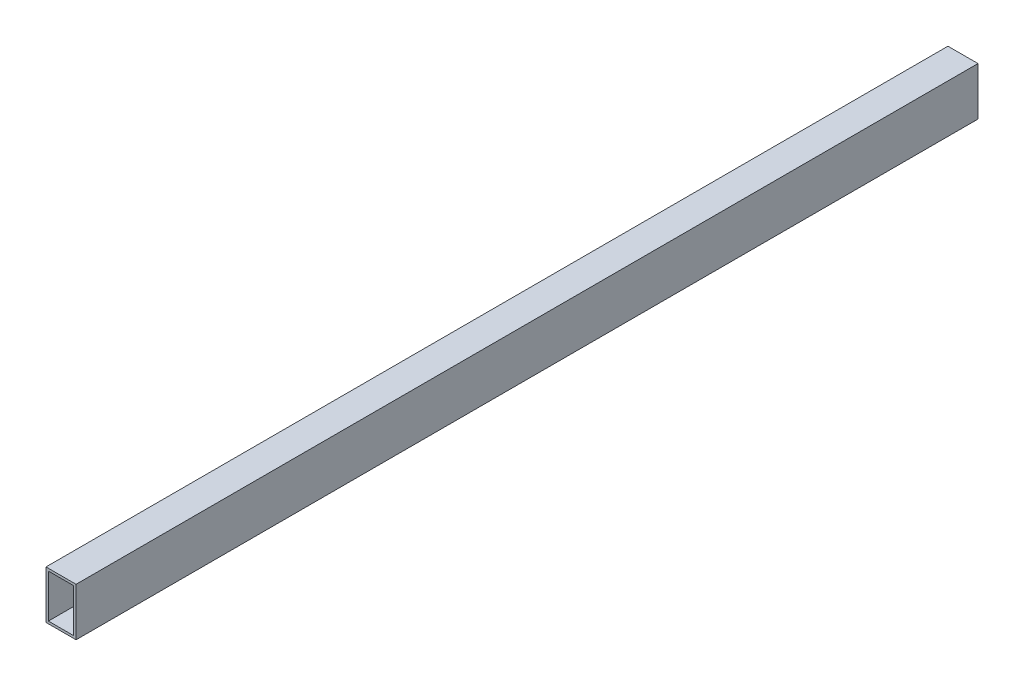
ISO-10303-21;
HEADER;
FILE_DESCRIPTION(('STEP AP214'),'2;1');
FILE_NAME('part.step','',(''),(''),'','','');
FILE_SCHEMA(('AUTOMOTIVE_DESIGN { 1 0 10303 214 1 1 1 1 }'));
ENDSEC;
DATA;
#1=APPLICATION_CONTEXT('core data for automotive mechanical design processes');
#2=APPLICATION_PROTOCOL_DEFINITION('international standard','automotive_design',2000,#1);
#3=PRODUCT_CONTEXT('',#1,'mechanical');
#4=PRODUCT('Part','Part','',(#3));
#5=PRODUCT_RELATED_PRODUCT_CATEGORY('part','',(#4));
#6=PRODUCT_DEFINITION_FORMATION('','',#4);
#7=PRODUCT_DEFINITION_CONTEXT('part definition',#1,'design');
#8=PRODUCT_DEFINITION('design','',#6,#7);
#9=PRODUCT_DEFINITION_SHAPE('','',#8);
#10=(LENGTH_UNIT() NAMED_UNIT(*) SI_UNIT(.MILLI.,.METRE.));
#11=(NAMED_UNIT(*) PLANE_ANGLE_UNIT() SI_UNIT($,.RADIAN.));
#12=(NAMED_UNIT(*) SI_UNIT($,.STERADIAN.) SOLID_ANGLE_UNIT());
#13=UNCERTAINTY_MEASURE_WITH_UNIT(LENGTH_MEASURE(1.E-05),#10,'distance_accuracy_value','');
#14=(GEOMETRIC_REPRESENTATION_CONTEXT(3) GLOBAL_UNCERTAINTY_ASSIGNED_CONTEXT((#13)) GLOBAL_UNIT_ASSIGNED_CONTEXT((#10,
#11,#12)) REPRESENTATION_CONTEXT('',''));
#15=CARTESIAN_POINT('',(0.,0.,0.));
#16=DIRECTION('',(0.,0.,1.));
#17=DIRECTION('',(1.,0.,0.));
#18=AXIS2_PLACEMENT_3D('',#15,#16,#17);
#19=CARTESIAN_POINT('',(-25.,40.,1500.));
#20=DIRECTION('',(1.,0.,0.));
#21=DIRECTION('',(0.,1.,0.));
#22=AXIS2_PLACEMENT_3D('',#19,#20,#21);
#23=PLANE('',#22);
#24=DIRECTION('',(0.,-1.,0.));
#25=VECTOR('',#24,1.);
#26=CARTESIAN_POINT('',(-25.,40.,0.));
#27=LINE('',#26,#25);
#28=CARTESIAN_POINT('',(-25.,40.,0.));
#29=VERTEX_POINT('',#28);
#30=CARTESIAN_POINT('',(-25.,-40.,0.));
#31=VERTEX_POINT('',#30);
#32=EDGE_CURVE('E131',#29,#31,#27,.T.);
#33=ORIENTED_EDGE('',*,*,#32,.T.);
#34=DIRECTION('',(0.,0.,-1.));
#35=VECTOR('',#34,1.);
#36=CARTESIAN_POINT('',(-25.,-40.,1500.));
#37=LINE('',#36,#35);
#38=CARTESIAN_POINT('',(-25.,-40.,1500.));
#39=VERTEX_POINT('',#38);
#40=EDGE_CURVE('E11',#39,#31,#37,.T.);
#41=ORIENTED_EDGE('',*,*,#40,.F.);
#42=DIRECTION('',(0.,-1.,0.));
#43=VECTOR('',#42,1.);
#44=CARTESIAN_POINT('',(-25.,40.,1500.));
#45=LINE('',#44,#43);
#46=CARTESIAN_POINT('',(-25.,40.,1500.));
#47=VERTEX_POINT('',#46);
#48=EDGE_CURVE('E135',#47,#39,#45,.T.);
#49=ORIENTED_EDGE('',*,*,#48,.F.);
#50=DIRECTION('',(0.,0.,-1.));
#51=VECTOR('',#50,1.);
#52=CARTESIAN_POINT('',(-25.,40.,1500.));
#53=LINE('',#52,#51);
#54=EDGE_CURVE('E147',#47,#29,#53,.T.);
#55=ORIENTED_EDGE('',*,*,#54,.T.);
#56=EDGE_LOOP('',(#33,#41,#49,#55));
#57=FACE_BOUND('',#56,.T.);
#58=ADVANCED_FACE('F34',(#57),#23,.F.);
#59=CARTESIAN_POINT('',(-25.,-40.,1500.));
#60=DIRECTION('',(0.,1.,0.));
#61=DIRECTION('',(0.,0.,1.));
#62=AXIS2_PLACEMENT_3D('',#59,#60,#61);
#63=PLANE('',#62);
#64=DIRECTION('',(1.,0.,0.));
#65=VECTOR('',#64,1.);
#66=CARTESIAN_POINT('',(-25.,-40.,0.));
#67=LINE('',#66,#65);
#68=CARTESIAN_POINT('',(25.,-40.,0.));
#69=VERTEX_POINT('',#68);
#70=EDGE_CURVE('E150',#31,#69,#67,.T.);
#71=ORIENTED_EDGE('',*,*,#70,.T.);
#72=DIRECTION('',(0.,0.,-1.));
#73=VECTOR('',#72,1.);
#74=CARTESIAN_POINT('',(25.,-40.,1500.));
#75=LINE('',#74,#73);
#76=CARTESIAN_POINT('',(25.,-40.,1500.));
#77=VERTEX_POINT('',#76);
#78=EDGE_CURVE('E41',#77,#69,#75,.T.);
#79=ORIENTED_EDGE('',*,*,#78,.F.);
#80=DIRECTION('',(1.,0.,0.));
#81=VECTOR('',#80,1.);
#82=CARTESIAN_POINT('',(-25.,-40.,1500.));
#83=LINE('',#82,#81);
#84=EDGE_CURVE('E138',#39,#77,#83,.T.);
#85=ORIENTED_EDGE('',*,*,#84,.F.);
#86=ORIENTED_EDGE('',*,*,#40,.T.);
#87=EDGE_LOOP('',(#71,#79,#85,#86));
#88=FACE_BOUND('',#87,.T.);
#89=ADVANCED_FACE('F166',(#88),#63,.F.);
#90=CARTESIAN_POINT('',(25.,40.,1500.));
#91=DIRECTION('',(1.,0.,0.));
#92=DIRECTION('',(0.,0.,-1.));
#93=AXIS2_PLACEMENT_3D('',#90,#91,#92);
#94=PLANE('',#93);
#95=DIRECTION('',(0.,-1.,0.));
#96=VECTOR('',#95,1.);
#97=CARTESIAN_POINT('',(25.,40.,0.));
#98=LINE('',#97,#96);
#99=CARTESIAN_POINT('',(25.,40.,0.));
#100=VERTEX_POINT('',#99);
#101=EDGE_CURVE('E153',#100,#69,#98,.T.);
#102=ORIENTED_EDGE('',*,*,#101,.F.);
#103=DIRECTION('',(0.,0.,-1.));
#104=VECTOR('',#103,1.);
#105=CARTESIAN_POINT('',(25.,40.,1500.));
#106=LINE('',#105,#104);
#107=CARTESIAN_POINT('',(25.,40.,1500.));
#108=VERTEX_POINT('',#107);
#109=EDGE_CURVE('E159',#108,#100,#106,.T.);
#110=ORIENTED_EDGE('',*,*,#109,.F.);
#111=DIRECTION('',(0.,-1.,0.));
#112=VECTOR('',#111,1.);
#113=CARTESIAN_POINT('',(25.,40.,1500.));
#114=LINE('',#113,#112);
#115=EDGE_CURVE('E141',#108,#77,#114,.T.);
#116=ORIENTED_EDGE('',*,*,#115,.T.);
#117=ORIENTED_EDGE('',*,*,#78,.T.);
#118=EDGE_LOOP('',(#102,#110,#116,#117));
#119=FACE_BOUND('',#118,.T.);
#120=ADVANCED_FACE('F163',(#119),#94,.T.);
#121=CARTESIAN_POINT('',(-25.,40.,1500.));
#122=DIRECTION('',(0.,1.,0.));
#123=DIRECTION('',(0.,0.,1.));
#124=AXIS2_PLACEMENT_3D('',#121,#122,#123);
#125=PLANE('',#124);
#126=DIRECTION('',(1.,0.,0.));
#127=VECTOR('',#126,1.);
#128=CARTESIAN_POINT('',(-25.,40.,0.));
#129=LINE('',#128,#127);
#130=EDGE_CURVE('E139',#29,#100,#129,.T.);
#131=ORIENTED_EDGE('',*,*,#130,.F.);
#132=ORIENTED_EDGE('',*,*,#54,.F.);
#133=DIRECTION('',(1.,0.,0.));
#134=VECTOR('',#133,1.);
#135=CARTESIAN_POINT('',(-25.,40.,1500.));
#136=LINE('',#135,#134);
#137=EDGE_CURVE('E144',#47,#108,#136,.T.);
#138=ORIENTED_EDGE('',*,*,#137,.T.);
#139=ORIENTED_EDGE('',*,*,#109,.T.);
#140=EDGE_LOOP('',(#131,#132,#138,#139));
#141=FACE_BOUND('',#140,.T.);
#142=ADVANCED_FACE('F173',(#141),#125,.T.);
#143=CARTESIAN_POINT('',(0.,0.,1500.));
#144=DIRECTION('',(0.,0.,1.));
#145=DIRECTION('',(1.,0.,0.));
#146=AXIS2_PLACEMENT_3D('',#143,#144,#145);
#147=PLANE('',#146);
#148=DIRECTION('',(0.,1.,0.));
#149=VECTOR('',#148,1.);
#150=CARTESIAN_POINT('',(-21.,36.,1500.));
#151=LINE('',#150,#149);
#152=CARTESIAN_POINT('',(-21.,-36.,1500.));
#153=VERTEX_POINT('',#152);
#154=CARTESIAN_POINT('',(-21.,36.,1500.));
#155=VERTEX_POINT('',#154);
#156=EDGE_CURVE('E100',#153,#155,#151,.T.);
#157=ORIENTED_EDGE('',*,*,#156,.T.);
#158=DIRECTION('',(1.,0.,0.));
#159=VECTOR('',#158,1.);
#160=CARTESIAN_POINT('',(21.,36.,1500.));
#161=LINE('',#160,#159);
#162=CARTESIAN_POINT('',(21.,36.,1500.));
#163=VERTEX_POINT('',#162);
#164=EDGE_CURVE('E109',#155,#163,#161,.T.);
#165=ORIENTED_EDGE('',*,*,#164,.T.);
#166=DIRECTION('',(0.,-1.,0.));
#167=VECTOR('',#166,1.);
#168=CARTESIAN_POINT('',(21.,36.,1500.));
#169=LINE('',#168,#167);
#170=CARTESIAN_POINT('',(21.,-36.,1500.));
#171=VERTEX_POINT('',#170);
#172=EDGE_CURVE('E48',#163,#171,#169,.T.);
#173=ORIENTED_EDGE('',*,*,#172,.T.);
#174=DIRECTION('',(-1.,0.,0.));
#175=VECTOR('',#174,1.);
#176=CARTESIAN_POINT('',(21.,-36.,1500.));
#177=LINE('',#176,#175);
#178=EDGE_CURVE('E106',#171,#153,#177,.T.);
#179=ORIENTED_EDGE('',*,*,#178,.T.);
#180=EDGE_LOOP('',(#157,#165,#173,#179));
#181=FACE_BOUND('',#180,.T.);
#182=ORIENTED_EDGE('',*,*,#48,.T.);
#183=ORIENTED_EDGE('',*,*,#84,.T.);
#184=ORIENTED_EDGE('',*,*,#115,.F.);
#185=ORIENTED_EDGE('',*,*,#137,.F.);
#186=EDGE_LOOP('',(#182,#183,#184,#185));
#187=FACE_BOUND('',#186,.T.);
#188=ADVANCED_FACE('F113',(#181,#187),#147,.T.);
#189=CARTESIAN_POINT('',(0.,0.,0.));
#190=DIRECTION('',(0.,0.,1.));
#191=DIRECTION('',(1.,0.,0.));
#192=AXIS2_PLACEMENT_3D('',#189,#190,#191);
#193=PLANE('',#192);
#194=DIRECTION('',(1.,0.,0.));
#195=VECTOR('',#194,1.);
#196=CARTESIAN_POINT('',(21.,36.,0.));
#197=LINE('',#196,#195);
#198=CARTESIAN_POINT('',(-21.,36.,0.));
#199=VERTEX_POINT('',#198);
#200=CARTESIAN_POINT('',(21.,36.,0.));
#201=VERTEX_POINT('',#200);
#202=EDGE_CURVE('E125',#199,#201,#197,.T.);
#203=ORIENTED_EDGE('',*,*,#202,.F.);
#204=DIRECTION('',(0.,1.,0.));
#205=VECTOR('',#204,1.);
#206=CARTESIAN_POINT('',(-21.,36.,0.));
#207=LINE('',#206,#205);
#208=CARTESIAN_POINT('',(-21.,-36.,0.));
#209=VERTEX_POINT('',#208);
#210=EDGE_CURVE('E56',#209,#199,#207,.T.);
#211=ORIENTED_EDGE('',*,*,#210,.F.);
#212=DIRECTION('',(-1.,0.,0.));
#213=VECTOR('',#212,1.);
#214=CARTESIAN_POINT('',(21.,-36.,0.));
#215=LINE('',#214,#213);
#216=CARTESIAN_POINT('',(21.,-36.,0.));
#217=VERTEX_POINT('',#216);
#218=EDGE_CURVE('E116',#217,#209,#215,.T.);
#219=ORIENTED_EDGE('',*,*,#218,.F.);
#220=DIRECTION('',(0.,-1.,0.));
#221=VECTOR('',#220,1.);
#222=CARTESIAN_POINT('',(21.,36.,0.));
#223=LINE('',#222,#221);
#224=EDGE_CURVE('E119',#201,#217,#223,.T.);
#225=ORIENTED_EDGE('',*,*,#224,.F.);
#226=EDGE_LOOP('',(#203,#211,#219,#225));
#227=FACE_BOUND('',#226,.T.);
#228=ORIENTED_EDGE('',*,*,#32,.F.);
#229=ORIENTED_EDGE('',*,*,#130,.T.);
#230=ORIENTED_EDGE('',*,*,#101,.T.);
#231=ORIENTED_EDGE('',*,*,#70,.F.);
#232=EDGE_LOOP('',(#228,#229,#230,#231));
#233=FACE_BOUND('',#232,.T.);
#234=ADVANCED_FACE('F170',(#227,#233),#193,.F.);
#235=CARTESIAN_POINT('',(-21.,36.,1500.));
#236=DIRECTION('',(-1.,0.,0.));
#237=DIRECTION('',(0.,-1.,0.));
#238=AXIS2_PLACEMENT_3D('',#235,#236,#237);
#239=PLANE('',#238);
#240=ORIENTED_EDGE('',*,*,#210,.T.);
#241=DIRECTION('',(0.,0.,-1.));
#242=VECTOR('',#241,1.);
#243=CARTESIAN_POINT('',(-21.,36.,1500.));
#244=LINE('',#243,#242);
#245=EDGE_CURVE('E96',#155,#199,#244,.T.);
#246=ORIENTED_EDGE('',*,*,#245,.F.);
#247=ORIENTED_EDGE('',*,*,#156,.F.);
#248=DIRECTION('',(0.,0.,-1.));
#249=VECTOR('',#248,1.);
#250=CARTESIAN_POINT('',(-21.,-36.,1500.));
#251=LINE('',#250,#249);
#252=EDGE_CURVE('E129',#153,#209,#251,.T.);
#253=ORIENTED_EDGE('',*,*,#252,.T.);
#254=EDGE_LOOP('',(#240,#246,#247,#253));
#255=FACE_BOUND('',#254,.T.);
#256=ADVANCED_FACE('F98',(#255),#239,.F.);
#257=CARTESIAN_POINT('',(21.,-36.,1500.));
#258=DIRECTION('',(0.,-1.,0.));
#259=DIRECTION('',(0.,0.,-1.));
#260=AXIS2_PLACEMENT_3D('',#257,#258,#259);
#261=PLANE('',#260);
#262=ORIENTED_EDGE('',*,*,#218,.T.);
#263=ORIENTED_EDGE('',*,*,#252,.F.);
#264=ORIENTED_EDGE('',*,*,#178,.F.);
#265=DIRECTION('',(0.,0.,-1.));
#266=VECTOR('',#265,1.);
#267=CARTESIAN_POINT('',(21.,-36.,1500.));
#268=LINE('',#267,#266);
#269=EDGE_CURVE('E132',#171,#217,#268,.T.);
#270=ORIENTED_EDGE('',*,*,#269,.T.);
#271=EDGE_LOOP('',(#262,#263,#264,#270));
#272=FACE_BOUND('',#271,.T.);
#273=ADVANCED_FACE('F195',(#272),#261,.F.);
#274=CARTESIAN_POINT('',(21.,36.,1500.));
#275=DIRECTION('',(1.,0.,0.));
#276=DIRECTION('',(0.,1.,0.));
#277=AXIS2_PLACEMENT_3D('',#274,#275,#276);
#278=PLANE('',#277);
#279=ORIENTED_EDGE('',*,*,#224,.T.);
#280=ORIENTED_EDGE('',*,*,#269,.F.);
#281=ORIENTED_EDGE('',*,*,#172,.F.);
#282=DIRECTION('',(0.,0.,-1.));
#283=VECTOR('',#282,1.);
#284=CARTESIAN_POINT('',(21.,36.,1500.));
#285=LINE('',#284,#283);
#286=EDGE_CURVE('E105',#163,#201,#285,.T.);
#287=ORIENTED_EDGE('',*,*,#286,.T.);
#288=EDGE_LOOP('',(#279,#280,#281,#287));
#289=FACE_BOUND('',#288,.T.);
#290=ADVANCED_FACE('F198',(#289),#278,.F.);
#291=CARTESIAN_POINT('',(21.,36.,1500.));
#292=DIRECTION('',(0.,1.,0.));
#293=DIRECTION('',(0.,0.,1.));
#294=AXIS2_PLACEMENT_3D('',#291,#292,#293);
#295=PLANE('',#294);
#296=ORIENTED_EDGE('',*,*,#202,.T.);
#297=ORIENTED_EDGE('',*,*,#286,.F.);
#298=ORIENTED_EDGE('',*,*,#164,.F.);
#299=ORIENTED_EDGE('',*,*,#245,.T.);
#300=EDGE_LOOP('',(#296,#297,#298,#299));
#301=FACE_BOUND('',#300,.T.);
#302=ADVANCED_FACE('F110',(#301),#295,.F.);
#303=CLOSED_SHELL('',(#58,#89,#120,#142,#188,#234,#256,#273,#290,#302));
#304=MANIFOLD_SOLID_BREP('B2',#303);
#305=ADVANCED_BREP_SHAPE_REPRESENTATION('',(#18,#304),#14);
#306=SHAPE_DEFINITION_REPRESENTATION(#9,#305);
ENDSEC;
END-ISO-10303-21;
